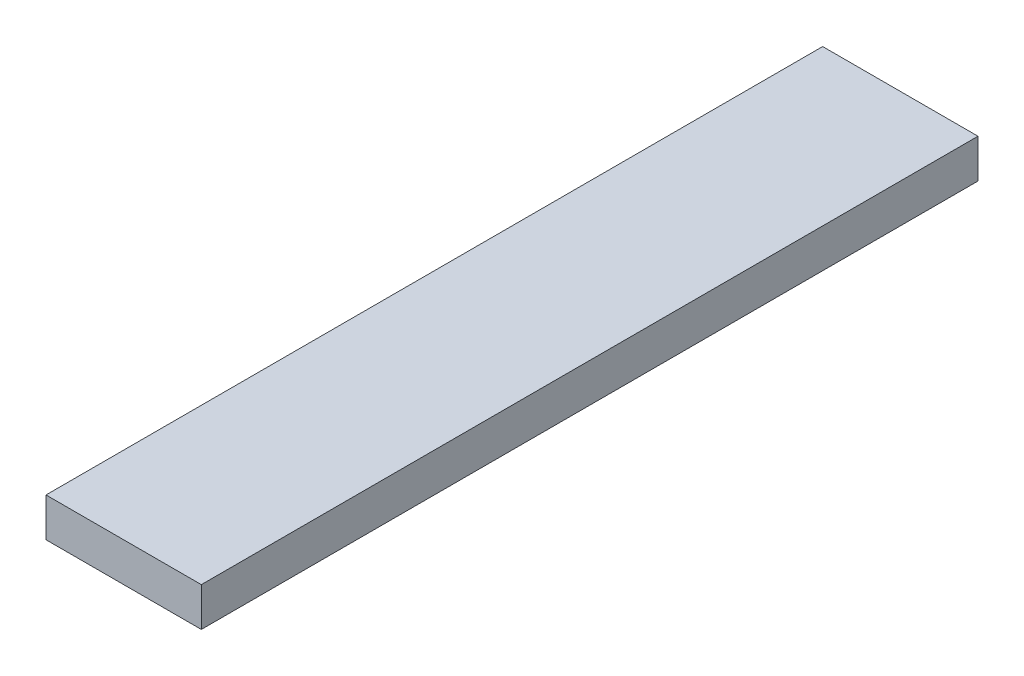
ISO-10303-21;
HEADER;
FILE_DESCRIPTION(('STEP AP214'),'2;1');
FILE_NAME('part.step','',(''),(''),'','','');
FILE_SCHEMA(('AUTOMOTIVE_DESIGN { 1 0 10303 214 1 1 1 1 }'));
ENDSEC;
DATA;
#1=APPLICATION_CONTEXT('core data for automotive mechanical design processes');
#2=APPLICATION_PROTOCOL_DEFINITION('international standard','automotive_design',2000,#1);
#3=PRODUCT_CONTEXT('',#1,'mechanical');
#4=PRODUCT('Part','Part','',(#3));
#5=PRODUCT_RELATED_PRODUCT_CATEGORY('part','',(#4));
#6=PRODUCT_DEFINITION_FORMATION('','',#4);
#7=PRODUCT_DEFINITION_CONTEXT('part definition',#1,'design');
#8=PRODUCT_DEFINITION('design','',#6,#7);
#9=PRODUCT_DEFINITION_SHAPE('','',#8);
#10=(LENGTH_UNIT() NAMED_UNIT(*) SI_UNIT(.MILLI.,.METRE.));
#11=(NAMED_UNIT(*) PLANE_ANGLE_UNIT() SI_UNIT($,.RADIAN.));
#12=(NAMED_UNIT(*) SI_UNIT($,.STERADIAN.) SOLID_ANGLE_UNIT());
#13=UNCERTAINTY_MEASURE_WITH_UNIT(LENGTH_MEASURE(1.E-05),#10,'distance_accuracy_value','');
#14=(GEOMETRIC_REPRESENTATION_CONTEXT(3) GLOBAL_UNCERTAINTY_ASSIGNED_CONTEXT((#13)) GLOBAL_UNIT_ASSIGNED_CONTEXT((#10,
#11,#12)) REPRESENTATION_CONTEXT('',''));
#15=CARTESIAN_POINT('',(0.,0.,0.));
#16=DIRECTION('',(0.,0.,1.));
#17=DIRECTION('',(1.,0.,0.));
#18=AXIS2_PLACEMENT_3D('',#15,#16,#17);
#19=CARTESIAN_POINT('',(0.,6.34999999999997,0.));
#20=DIRECTION('',(1.,0.,0.));
#21=DIRECTION('',(0.,0.,-1.));
#22=AXIS2_PLACEMENT_3D('',#19,#20,#21);
#23=PLANE('',#22);
#24=DIRECTION('',(0.,0.,1.));
#25=VECTOR('',#24,1.);
#26=CARTESIAN_POINT('',(0.,0.,0.));
#27=LINE('',#26,#25);
#28=CARTESIAN_POINT('',(0.,0.,-304.8));
#29=VERTEX_POINT('',#28);
#30=CARTESIAN_POINT('',(0.,0.,-177.8));
#31=VERTEX_POINT('',#30);
#32=EDGE_CURVE('E99',#29,#31,#27,.T.);
#33=ORIENTED_EDGE('',*,*,#32,.T.);
#34=DIRECTION('',(0.,1.,0.));
#35=VECTOR('',#34,1.);
#36=CARTESIAN_POINT('',(0.,0.,-177.8));
#37=LINE('',#36,#35);
#38=CARTESIAN_POINT('',(0.,6.34999999999997,-177.8));
#39=VERTEX_POINT('',#38);
#40=EDGE_CURVE('E48',#31,#39,#37,.T.);
#41=ORIENTED_EDGE('',*,*,#40,.T.);
#42=DIRECTION('',(0.,0.,1.));
#43=VECTOR('',#42,1.);
#44=CARTESIAN_POINT('',(0.,6.34999999999997,0.));
#45=LINE('',#44,#43);
#46=CARTESIAN_POINT('',(0.,6.34999999999997,-304.8));
#47=VERTEX_POINT('',#46);
#48=EDGE_CURVE('E101',#47,#39,#45,.T.);
#49=ORIENTED_EDGE('',*,*,#48,.F.);
#50=DIRECTION('',(0.,-1.,0.));
#51=VECTOR('',#50,1.);
#52=CARTESIAN_POINT('',(0.,6.34999999999997,-304.8));
#53=LINE('',#52,#51);
#54=EDGE_CURVE('E11',#47,#29,#53,.T.);
#55=ORIENTED_EDGE('',*,*,#54,.T.);
#56=EDGE_LOOP('',(#33,#41,#49,#55));
#57=FACE_BOUND('',#56,.T.);
#58=ADVANCED_FACE('F34',(#57),#23,.F.);
#59=CARTESIAN_POINT('',(0.,6.34999999999997,-304.8));
#60=DIRECTION('',(0.,0.,1.));
#61=DIRECTION('',(1.,0.,0.));
#62=AXIS2_PLACEMENT_3D('',#59,#60,#61);
#63=PLANE('',#62);
#64=DIRECTION('',(-1.,0.,0.));
#65=VECTOR('',#64,1.);
#66=CARTESIAN_POINT('',(0.,6.34999999999997,-304.8));
#67=LINE('',#66,#65);
#68=CARTESIAN_POINT('',(25.4,6.34999999999997,-304.800000000001));
#69=VERTEX_POINT('',#68);
#70=EDGE_CURVE('E41',#69,#47,#67,.T.);
#71=ORIENTED_EDGE('',*,*,#70,.F.);
#72=DIRECTION('',(0.,1.,0.));
#73=VECTOR('',#72,1.);
#74=CARTESIAN_POINT('',(25.4,0.,-304.800000000001));
#75=LINE('',#74,#73);
#76=CARTESIAN_POINT('',(25.4,0.,-304.800000000001));
#77=VERTEX_POINT('',#76);
#78=EDGE_CURVE('E97',#77,#69,#75,.T.);
#79=ORIENTED_EDGE('',*,*,#78,.F.);
#80=DIRECTION('',(-1.,0.,0.));
#81=VECTOR('',#80,1.);
#82=CARTESIAN_POINT('',(0.,0.,-304.8));
#83=LINE('',#82,#81);
#84=EDGE_CURVE('E91',#77,#29,#83,.T.);
#85=ORIENTED_EDGE('',*,*,#84,.T.);
#86=ORIENTED_EDGE('',*,*,#54,.F.);
#87=EDGE_LOOP('',(#71,#79,#85,#86));
#88=FACE_BOUND('',#87,.T.);
#89=ADVANCED_FACE('F105',(#88),#63,.F.);
#90=CARTESIAN_POINT('',(0.,6.34999999999997,0.));
#91=DIRECTION('',(0.,-1.,0.));
#92=DIRECTION('',(0.,0.,-1.));
#93=AXIS2_PLACEMENT_3D('',#90,#91,#92);
#94=PLANE('',#93);
#95=DIRECTION('',(-1.,0.,0.));
#96=VECTOR('',#95,1.);
#97=CARTESIAN_POINT('',(25.4,6.34999999999997,-177.8));
#98=LINE('',#97,#96);
#99=CARTESIAN_POINT('',(25.4,6.34999999999997,-177.8));
#100=VERTEX_POINT('',#99);
#101=EDGE_CURVE('E92',#100,#39,#98,.T.);
#102=ORIENTED_EDGE('',*,*,#101,.F.);
#103=DIRECTION('',(0.,0.,1.));
#104=VECTOR('',#103,1.);
#105=CARTESIAN_POINT('',(25.4,6.34999999999997,-304.800000000001));
#106=LINE('',#105,#104);
#107=EDGE_CURVE('E80',#69,#100,#106,.T.);
#108=ORIENTED_EDGE('',*,*,#107,.F.);
#109=ORIENTED_EDGE('',*,*,#70,.T.);
#110=ORIENTED_EDGE('',*,*,#48,.T.);
#111=EDGE_LOOP('',(#102,#108,#109,#110));
#112=FACE_BOUND('',#111,.T.);
#113=ADVANCED_FACE('F108',(#112),#94,.F.);
#114=CARTESIAN_POINT('',(0.,0.,0.));
#115=DIRECTION('',(0.,-1.,0.));
#116=DIRECTION('',(0.,0.,-1.));
#117=AXIS2_PLACEMENT_3D('',#114,#115,#116);
#118=PLANE('',#117);
#119=DIRECTION('',(0.,0.,1.));
#120=VECTOR('',#119,1.);
#121=CARTESIAN_POINT('',(25.4,0.,-304.800000000001));
#122=LINE('',#121,#120);
#123=CARTESIAN_POINT('',(25.4,0.,-177.8));
#124=VERTEX_POINT('',#123);
#125=EDGE_CURVE('E78',#77,#124,#122,.T.);
#126=ORIENTED_EDGE('',*,*,#125,.T.);
#127=DIRECTION('',(-1.,0.,0.));
#128=VECTOR('',#127,1.);
#129=CARTESIAN_POINT('',(25.4,0.,-177.8));
#130=LINE('',#129,#128);
#131=EDGE_CURVE('E82',#124,#31,#130,.T.);
#132=ORIENTED_EDGE('',*,*,#131,.T.);
#133=ORIENTED_EDGE('',*,*,#32,.F.);
#134=ORIENTED_EDGE('',*,*,#84,.F.);
#135=EDGE_LOOP('',(#126,#132,#133,#134));
#136=FACE_BOUND('',#135,.T.);
#137=ADVANCED_FACE('F90',(#136),#118,.T.);
#138=CARTESIAN_POINT('',(25.4,0.,-304.800000000001));
#139=DIRECTION('',(-1.,0.,0.));
#140=DIRECTION('',(0.,0.,1.));
#141=AXIS2_PLACEMENT_3D('',#138,#139,#140);
#142=PLANE('',#141);
#143=ORIENTED_EDGE('',*,*,#107,.T.);
#144=DIRECTION('',(0.,1.,0.));
#145=VECTOR('',#144,1.);
#146=CARTESIAN_POINT('',(25.4,0.,-177.8));
#147=LINE('',#146,#145);
#148=EDGE_CURVE('E75',#124,#100,#147,.T.);
#149=ORIENTED_EDGE('',*,*,#148,.F.);
#150=ORIENTED_EDGE('',*,*,#125,.F.);
#151=ORIENTED_EDGE('',*,*,#78,.T.);
#152=EDGE_LOOP('',(#143,#149,#150,#151));
#153=FACE_BOUND('',#152,.T.);
#154=ADVANCED_FACE('F76',(#153),#142,.F.);
#155=CARTESIAN_POINT('',(25.4,0.,-177.8));
#156=DIRECTION('',(0.,0.,-1.));
#157=DIRECTION('',(-1.,0.,0.));
#158=AXIS2_PLACEMENT_3D('',#155,#156,#157);
#159=PLANE('',#158);
#160=ORIENTED_EDGE('',*,*,#101,.T.);
#161=ORIENTED_EDGE('',*,*,#40,.F.);
#162=ORIENTED_EDGE('',*,*,#131,.F.);
#163=ORIENTED_EDGE('',*,*,#148,.T.);
#164=EDGE_LOOP('',(#160,#161,#162,#163));
#165=FACE_BOUND('',#164,.T.);
#166=ADVANCED_FACE('F84',(#165),#159,.F.);
#167=CLOSED_SHELL('',(#58,#89,#113,#137,#154,#166));
#168=MANIFOLD_SOLID_BREP('B2',#167);
#169=ADVANCED_BREP_SHAPE_REPRESENTATION('',(#18,#168),#14);
#170=SHAPE_DEFINITION_REPRESENTATION(#9,#169);
ENDSEC;
END-ISO-10303-21;
